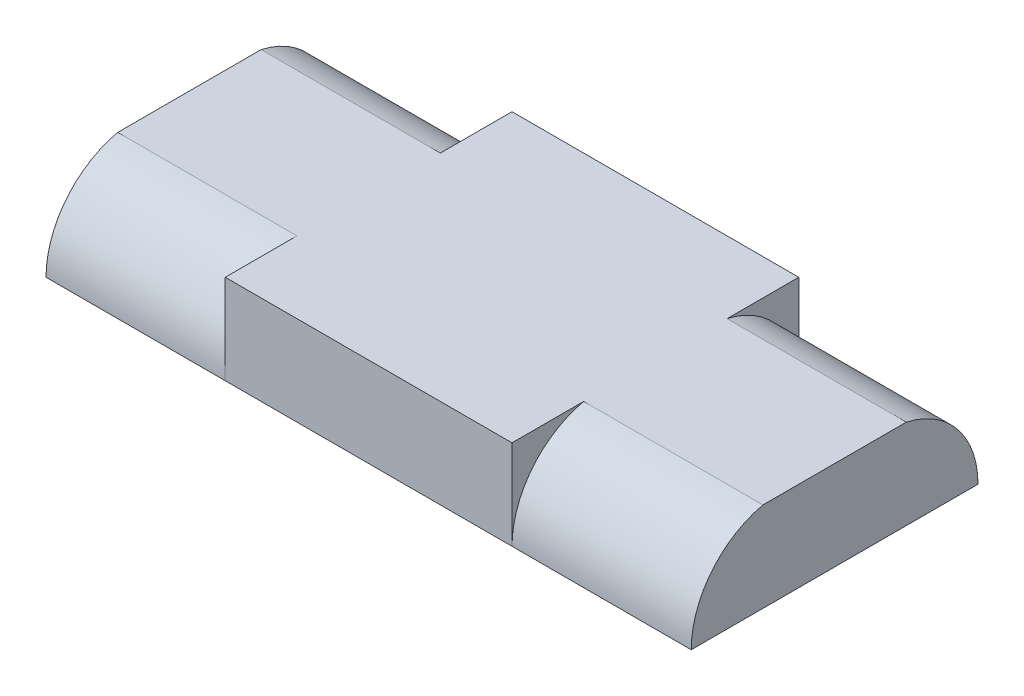
ISO-10303-21;
HEADER;
FILE_DESCRIPTION(('STEP AP214'),'2;1');
FILE_NAME('part.step','',(''),(''),'','','');
FILE_SCHEMA(('AUTOMOTIVE_DESIGN { 1 0 10303 214 1 1 1 1 }'));
ENDSEC;
DATA;
#1=APPLICATION_CONTEXT('core data for automotive mechanical design processes');
#2=APPLICATION_PROTOCOL_DEFINITION('international standard','automotive_design',2000,#1);
#3=PRODUCT_CONTEXT('',#1,'mechanical');
#4=PRODUCT('Part','Part','',(#3));
#5=PRODUCT_RELATED_PRODUCT_CATEGORY('part','',(#4));
#6=PRODUCT_DEFINITION_FORMATION('','',#4);
#7=PRODUCT_DEFINITION_CONTEXT('part definition',#1,'design');
#8=PRODUCT_DEFINITION('design','',#6,#7);
#9=PRODUCT_DEFINITION_SHAPE('','',#8);
#10=(LENGTH_UNIT() NAMED_UNIT(*) SI_UNIT(.MILLI.,.METRE.));
#11=(NAMED_UNIT(*) PLANE_ANGLE_UNIT() SI_UNIT($,.RADIAN.));
#12=(NAMED_UNIT(*) SI_UNIT($,.STERADIAN.) SOLID_ANGLE_UNIT());
#13=UNCERTAINTY_MEASURE_WITH_UNIT(LENGTH_MEASURE(1.E-05),#10,'distance_accuracy_value','');
#14=(GEOMETRIC_REPRESENTATION_CONTEXT(3) GLOBAL_UNCERTAINTY_ASSIGNED_CONTEXT((#13)) GLOBAL_UNIT_ASSIGNED_CONTEXT((#10,
#11,#12)) REPRESENTATION_CONTEXT('',''));
#15=CARTESIAN_POINT('',(0.,0.,0.));
#16=DIRECTION('',(0.,0.,1.));
#17=DIRECTION('',(1.,0.,0.));
#18=AXIS2_PLACEMENT_3D('',#15,#16,#17);
#19=CARTESIAN_POINT('',(8.,5.,-8.));
#20=DIRECTION('',(-1.,0.,0.));
#21=DIRECTION('',(0.,0.,1.));
#22=AXIS2_PLACEMENT_3D('',#19,#20,#21);
#23=PLANE('',#22);
#24=CARTESIAN_POINT('',(8.,0.,2.875));
#25=DIRECTION('',(1.,0.,0.));
#26=DIRECTION('',(0.,0.,1.));
#27=AXIS2_PLACEMENT_3D('',#24,#25,#26);
#28=CIRCLE('',#27,5.125);
#29=CARTESIAN_POINT('',(8.,5.,4.));
#30=VERTEX_POINT('',#29);
#31=CARTESIAN_POINT('',(8.,0.,8.));
#32=VERTEX_POINT('',#31);
#33=EDGE_CURVE('E225',#30,#32,#28,.T.);
#34=ORIENTED_EDGE('',*,*,#33,.F.);
#35=DIRECTION('',(0.,0.,-1.));
#36=VECTOR('',#35,1.);
#37=CARTESIAN_POINT('',(8.,5.,-8.));
#38=LINE('',#37,#36);
#39=CARTESIAN_POINT('',(8.,5.,8.));
#40=VERTEX_POINT('',#39);
#41=EDGE_CURVE('E351',#40,#30,#38,.T.);
#42=ORIENTED_EDGE('',*,*,#41,.F.);
#43=DIRECTION('',(0.,-1.,0.));
#44=VECTOR('',#43,1.);
#45=CARTESIAN_POINT('',(8.,5.,8.));
#46=LINE('',#45,#44);
#47=EDGE_CURVE('E363',#40,#32,#46,.T.);
#48=ORIENTED_EDGE('',*,*,#47,.T.);
#49=EDGE_LOOP('',(#34,#42,#48));
#50=FACE_BOUND('',#49,.T.);
#51=ADVANCED_FACE('F37',(#50),#23,.F.);
#52=CARTESIAN_POINT('',(0.,0.,0.));
#53=DIRECTION('',(0.,1.,0.));
#54=DIRECTION('',(0.,0.,1.));
#55=AXIS2_PLACEMENT_3D('',#52,#53,#54);
#56=PLANE('',#55);
#57=DIRECTION('',(1.,0.,0.));
#58=VECTOR('',#57,1.);
#59=CARTESIAN_POINT('',(-8.,0.,8.));
#60=LINE('',#59,#58);
#61=CARTESIAN_POINT('',(-8.,0.,8.));
#62=VERTEX_POINT('',#61);
#63=EDGE_CURVE('E204',#62,#32,#60,.T.);
#64=ORIENTED_EDGE('',*,*,#63,.F.);
#65=DIRECTION('',(1.,0.,0.));
#66=VECTOR('',#65,1.);
#67=CARTESIAN_POINT('',(-18.,0.,8.));
#68=LINE('',#67,#66);
#69=CARTESIAN_POINT('',(-18.,0.,8.));
#70=VERTEX_POINT('',#69);
#71=EDGE_CURVE('E200',#70,#62,#68,.T.);
#72=ORIENTED_EDGE('',*,*,#71,.F.);
#73=DIRECTION('',(0.,0.,1.));
#74=VECTOR('',#73,1.);
#75=CARTESIAN_POINT('',(-18.,0.,-4.));
#76=LINE('',#75,#74);
#77=CARTESIAN_POINT('',(-18.,0.,-8.));
#78=VERTEX_POINT('',#77);
#79=EDGE_CURVE('E186',#78,#70,#76,.T.);
#80=ORIENTED_EDGE('',*,*,#79,.F.);
#81=DIRECTION('',(1.,0.,0.));
#82=VECTOR('',#81,1.);
#83=CARTESIAN_POINT('',(-18.,0.,-8.));
#84=LINE('',#83,#82);
#85=CARTESIAN_POINT('',(-8.,0.,-8.));
#86=VERTEX_POINT('',#85);
#87=EDGE_CURVE('E218',#78,#86,#84,.T.);
#88=ORIENTED_EDGE('',*,*,#87,.T.);
#89=DIRECTION('',(-1.,0.,0.));
#90=VECTOR('',#89,1.);
#91=CARTESIAN_POINT('',(-8.,0.,-8.));
#92=LINE('',#91,#90);
#93=CARTESIAN_POINT('',(8.,0.,-8.));
#94=VERTEX_POINT('',#93);
#95=EDGE_CURVE('E323',#94,#86,#92,.T.);
#96=ORIENTED_EDGE('',*,*,#95,.F.);
#97=DIRECTION('',(-1.,0.,0.));
#98=VECTOR('',#97,1.);
#99=CARTESIAN_POINT('',(18.,0.,-8.));
#100=LINE('',#99,#98);
#101=CARTESIAN_POINT('',(18.,0.,-8.));
#102=VERTEX_POINT('',#101);
#103=EDGE_CURVE('E234',#102,#94,#100,.T.);
#104=ORIENTED_EDGE('',*,*,#103,.F.);
#105=DIRECTION('',(0.,0.,-1.));
#106=VECTOR('',#105,1.);
#107=CARTESIAN_POINT('',(18.,0.,4.));
#108=LINE('',#107,#106);
#109=CARTESIAN_POINT('',(18.,0.,8.));
#110=VERTEX_POINT('',#109);
#111=EDGE_CURVE('E297',#110,#102,#108,.T.);
#112=ORIENTED_EDGE('',*,*,#111,.F.);
#113=DIRECTION('',(-1.,0.,0.));
#114=VECTOR('',#113,1.);
#115=CARTESIAN_POINT('',(18.,0.,8.));
#116=LINE('',#115,#114);
#117=EDGE_CURVE('E222',#110,#32,#116,.T.);
#118=ORIENTED_EDGE('',*,*,#117,.T.);
#119=EDGE_LOOP('',(#64,#72,#80,#88,#96,#104,#112,#118));
#120=FACE_BOUND('',#119,.T.);
#121=DIRECTION('',(-1.,0.,0.));
#122=VECTOR('',#121,1.);
#123=CARTESIAN_POINT('',(0.,0.,3.));
#124=LINE('',#123,#122);
#125=CARTESIAN_POINT('',(17.,0.,3.));
#126=VERTEX_POINT('',#125);
#127=CARTESIAN_POINT('',(8.,0.,3.));
#128=VERTEX_POINT('',#127);
#129=EDGE_CURVE('E259',#126,#128,#124,.T.);
#130=ORIENTED_EDGE('',*,*,#129,.F.);
#131=DIRECTION('',(0.,0.,-1.));
#132=VECTOR('',#131,1.);
#133=CARTESIAN_POINT('',(17.,0.,0.));
#134=LINE('',#133,#132);
#135=CARTESIAN_POINT('',(17.,0.,-3.));
#136=VERTEX_POINT('',#135);
#137=EDGE_CURVE('E262',#126,#136,#134,.T.);
#138=ORIENTED_EDGE('',*,*,#137,.T.);
#139=DIRECTION('',(-1.,0.,0.));
#140=VECTOR('',#139,1.);
#141=CARTESIAN_POINT('',(18.,0.,-3.));
#142=LINE('',#141,#140);
#143=CARTESIAN_POINT('',(8.,0.,-3.));
#144=VERTEX_POINT('',#143);
#145=EDGE_CURVE('E246',#136,#144,#142,.T.);
#146=ORIENTED_EDGE('',*,*,#145,.T.);
#147=DIRECTION('',(0.,0.,-1.));
#148=VECTOR('',#147,1.);
#149=CARTESIAN_POINT('',(8.,0.,-8.));
#150=LINE('',#149,#148);
#151=EDGE_CURVE('E271',#128,#144,#150,.T.);
#152=ORIENTED_EDGE('',*,*,#151,.F.);
#153=EDGE_LOOP('',(#130,#138,#146,#152));
#154=FACE_BOUND('',#153,.T.);
#155=DIRECTION('',(1.,0.,0.));
#156=VECTOR('',#155,1.);
#157=CARTESIAN_POINT('',(-8.,0.,7.));
#158=LINE('',#157,#156);
#159=CARTESIAN_POINT('',(-7.,0.,7.));
#160=VERTEX_POINT('',#159);
#161=CARTESIAN_POINT('',(7.,0.,7.));
#162=VERTEX_POINT('',#161);
#163=EDGE_CURVE('E329',#160,#162,#158,.T.);
#164=ORIENTED_EDGE('',*,*,#163,.T.);
#165=DIRECTION('',(0.,0.,-1.));
#166=VECTOR('',#165,1.);
#167=CARTESIAN_POINT('',(7.,0.,-8.));
#168=LINE('',#167,#166);
#169=CARTESIAN_POINT('',(7.,0.,-7.));
#170=VERTEX_POINT('',#169);
#171=EDGE_CURVE('E319',#162,#170,#168,.T.);
#172=ORIENTED_EDGE('',*,*,#171,.T.);
#173=DIRECTION('',(-1.,0.,0.));
#174=VECTOR('',#173,1.);
#175=CARTESIAN_POINT('',(-8.,0.,-7.));
#176=LINE('',#175,#174);
#177=CARTESIAN_POINT('',(-7.,0.,-7.));
#178=VERTEX_POINT('',#177);
#179=EDGE_CURVE('E343',#170,#178,#176,.T.);
#180=ORIENTED_EDGE('',*,*,#179,.T.);
#181=DIRECTION('',(0.,0.,1.));
#182=VECTOR('',#181,1.);
#183=CARTESIAN_POINT('',(-7.,0.,-8.));
#184=LINE('',#183,#182);
#185=EDGE_CURVE('E346',#178,#160,#184,.T.);
#186=ORIENTED_EDGE('',*,*,#185,.T.);
#187=EDGE_LOOP('',(#164,#172,#180,#186));
#188=FACE_BOUND('',#187,.T.);
#189=DIRECTION('',(0.,0.,1.));
#190=VECTOR('',#189,1.);
#191=CARTESIAN_POINT('',(-8.,0.,-8.));
#192=LINE('',#191,#190);
#193=CARTESIAN_POINT('',(-8.,0.,-3.));
#194=VERTEX_POINT('',#193);
#195=CARTESIAN_POINT('',(-8.,0.,3.));
#196=VERTEX_POINT('',#195);
#197=EDGE_CURVE('E280',#194,#196,#192,.T.);
#198=ORIENTED_EDGE('',*,*,#197,.F.);
#199=DIRECTION('',(1.,0.,0.));
#200=VECTOR('',#199,1.);
#201=CARTESIAN_POINT('',(0.,0.,-3.));
#202=LINE('',#201,#200);
#203=CARTESIAN_POINT('',(-17.,0.,-3.));
#204=VERTEX_POINT('',#203);
#205=EDGE_CURVE('E267',#204,#194,#202,.T.);
#206=ORIENTED_EDGE('',*,*,#205,.F.);
#207=DIRECTION('',(0.,0.,1.));
#208=VECTOR('',#207,1.);
#209=CARTESIAN_POINT('',(-17.,0.,0.));
#210=LINE('',#209,#208);
#211=CARTESIAN_POINT('',(-17.,0.,3.));
#212=VERTEX_POINT('',#211);
#213=EDGE_CURVE('E258',#204,#212,#210,.T.);
#214=ORIENTED_EDGE('',*,*,#213,.T.);
#215=DIRECTION('',(1.,0.,0.));
#216=VECTOR('',#215,1.);
#217=CARTESIAN_POINT('',(-18.,0.,3.));
#218=LINE('',#217,#216);
#219=EDGE_CURVE('E256',#212,#196,#218,.T.);
#220=ORIENTED_EDGE('',*,*,#219,.T.);
#221=EDGE_LOOP('',(#198,#206,#214,#220));
#222=FACE_BOUND('',#221,.T.);
#223=ADVANCED_FACE('F201',(#120,#154,#188,#222),#56,.F.);
#224=CARTESIAN_POINT('',(8.,0.,-2.875));
#225=DIRECTION('',(1.,0.,0.));
#226=DIRECTION('',(0.,0.,-1.));
#227=AXIS2_PLACEMENT_3D('',#224,#225,#226);
#228=CIRCLE('',#227,5.125);
#229=CARTESIAN_POINT('',(8.,5.,-4.));
#230=VERTEX_POINT('',#229);
#231=EDGE_CURVE('E228',#94,#230,#228,.T.);
#232=ORIENTED_EDGE('',*,*,#231,.F.);
#233=DIRECTION('',(0.,-1.,0.));
#234=VECTOR('',#233,1.);
#235=CARTESIAN_POINT('',(8.,5.,-8.));
#236=LINE('',#235,#234);
#237=CARTESIAN_POINT('',(8.,5.,-8.));
#238=VERTEX_POINT('',#237);
#239=EDGE_CURVE('E44',#238,#94,#236,.T.);
#240=ORIENTED_EDGE('',*,*,#239,.F.);
#241=EDGE_CURVE('E355',#230,#238,#38,.T.);
#242=ORIENTED_EDGE('',*,*,#241,.F.);
#243=EDGE_LOOP('',(#232,#240,#242));
#244=FACE_BOUND('',#243,.T.);
#245=ADVANCED_FACE('F384',(#244),#23,.F.);
#246=CARTESIAN_POINT('',(-8.,5.,-8.));
#247=DIRECTION('',(1.,0.,0.));
#248=DIRECTION('',(0.,0.,-1.));
#249=AXIS2_PLACEMENT_3D('',#246,#247,#248);
#250=PLANE('',#249);
#251=DIRECTION('',(0.,-1.,0.));
#252=VECTOR('',#251,1.);
#253=CARTESIAN_POINT('',(-8.,5.,-8.));
#254=LINE('',#253,#252);
#255=CARTESIAN_POINT('',(-8.,5.,-8.));
#256=VERTEX_POINT('',#255);
#257=EDGE_CURVE('E372',#256,#86,#254,.T.);
#258=ORIENTED_EDGE('',*,*,#257,.T.);
#259=CARTESIAN_POINT('',(-8.,0.,-2.875));
#260=DIRECTION('',(1.,0.,0.));
#261=DIRECTION('',(0.,0.,-1.));
#262=AXIS2_PLACEMENT_3D('',#259,#260,#261);
#263=CIRCLE('',#262,5.125);
#264=CARTESIAN_POINT('',(-8.,5.,-4.));
#265=VERTEX_POINT('',#264);
#266=EDGE_CURVE('E207',#86,#265,#263,.T.);
#267=ORIENTED_EDGE('',*,*,#266,.T.);
#268=DIRECTION('',(0.,0.,1.));
#269=VECTOR('',#268,1.);
#270=CARTESIAN_POINT('',(-8.,5.,-8.));
#271=LINE('',#270,#269);
#272=EDGE_CURVE('E358',#256,#265,#271,.T.);
#273=ORIENTED_EDGE('',*,*,#272,.F.);
#274=EDGE_LOOP('',(#258,#267,#273));
#275=FACE_BOUND('',#274,.T.);
#276=ADVANCED_FACE('F394',(#275),#250,.F.);
#277=CARTESIAN_POINT('',(-8.,5.,4.));
#278=VERTEX_POINT('',#277);
#279=CARTESIAN_POINT('',(-8.,5.,8.));
#280=VERTEX_POINT('',#279);
#281=EDGE_CURVE('E357',#278,#280,#271,.T.);
#282=ORIENTED_EDGE('',*,*,#281,.F.);
#283=CARTESIAN_POINT('',(-8.,0.,2.875));
#284=DIRECTION('',(1.,0.,0.));
#285=DIRECTION('',(0.,0.,1.));
#286=AXIS2_PLACEMENT_3D('',#283,#284,#285);
#287=CIRCLE('',#286,5.125);
#288=EDGE_CURVE('E213',#278,#62,#287,.T.);
#289=ORIENTED_EDGE('',*,*,#288,.T.);
#290=DIRECTION('',(0.,-1.,0.));
#291=VECTOR('',#290,1.);
#292=CARTESIAN_POINT('',(-8.,5.,8.));
#293=LINE('',#292,#291);
#294=EDGE_CURVE('E369',#280,#62,#293,.T.);
#295=ORIENTED_EDGE('',*,*,#294,.F.);
#296=EDGE_LOOP('',(#282,#289,#295));
#297=FACE_BOUND('',#296,.T.);
#298=ADVANCED_FACE('F415',(#297),#250,.F.);
#299=CARTESIAN_POINT('',(-8.,5.,-8.));
#300=DIRECTION('',(0.,0.,1.));
#301=DIRECTION('',(1.,0.,0.));
#302=AXIS2_PLACEMENT_3D('',#299,#300,#301);
#303=PLANE('',#302);
#304=ORIENTED_EDGE('',*,*,#95,.T.);
#305=ORIENTED_EDGE('',*,*,#257,.F.);
#306=DIRECTION('',(-1.,0.,0.));
#307=VECTOR('',#306,1.);
#308=CARTESIAN_POINT('',(-8.,5.,-8.));
#309=LINE('',#308,#307);
#310=EDGE_CURVE('E354',#238,#256,#309,.T.);
#311=ORIENTED_EDGE('',*,*,#310,.F.);
#312=ORIENTED_EDGE('',*,*,#239,.T.);
#313=EDGE_LOOP('',(#304,#305,#311,#312));
#314=FACE_BOUND('',#313,.T.);
#315=ADVANCED_FACE('F378',(#314),#303,.F.);
#316=CARTESIAN_POINT('',(-8.,5.,8.));
#317=DIRECTION('',(0.,0.,-1.));
#318=DIRECTION('',(-1.,0.,0.));
#319=AXIS2_PLACEMENT_3D('',#316,#317,#318);
#320=PLANE('',#319);
#321=ORIENTED_EDGE('',*,*,#63,.T.);
#322=ORIENTED_EDGE('',*,*,#47,.F.);
#323=DIRECTION('',(1.,0.,0.));
#324=VECTOR('',#323,1.);
#325=CARTESIAN_POINT('',(-8.,5.,8.));
#326=LINE('',#325,#324);
#327=EDGE_CURVE('E361',#280,#40,#326,.T.);
#328=ORIENTED_EDGE('',*,*,#327,.F.);
#329=ORIENTED_EDGE('',*,*,#294,.T.);
#330=EDGE_LOOP('',(#321,#322,#328,#329));
#331=FACE_BOUND('',#330,.T.);
#332=ADVANCED_FACE('F410',(#331),#320,.F.);
#333=CARTESIAN_POINT('',(0.,5.,0.));
#334=DIRECTION('',(0.,1.,0.));
#335=DIRECTION('',(0.,0.,1.));
#336=AXIS2_PLACEMENT_3D('',#333,#334,#335);
#337=PLANE('',#336);
#338=ORIENTED_EDGE('',*,*,#41,.T.);
#339=DIRECTION('',(-1.,0.,0.));
#340=VECTOR('',#339,1.);
#341=CARTESIAN_POINT('',(18.,5.,4.));
#342=LINE('',#341,#340);
#343=CARTESIAN_POINT('',(18.,5.,4.));
#344=VERTEX_POINT('',#343);
#345=EDGE_CURVE('E302',#344,#30,#342,.T.);
#346=ORIENTED_EDGE('',*,*,#345,.F.);
#347=DIRECTION('',(0.,0.,1.));
#348=VECTOR('',#347,1.);
#349=CARTESIAN_POINT('',(18.,5.,4.));
#350=LINE('',#349,#348);
#351=CARTESIAN_POINT('',(18.,5.,-4.));
#352=VERTEX_POINT('',#351);
#353=EDGE_CURVE('E299',#352,#344,#350,.T.);
#354=ORIENTED_EDGE('',*,*,#353,.F.);
#355=DIRECTION('',(-1.,0.,0.));
#356=VECTOR('',#355,1.);
#357=CARTESIAN_POINT('',(18.,5.,-4.));
#358=LINE('',#357,#356);
#359=EDGE_CURVE('E197',#352,#230,#358,.T.);
#360=ORIENTED_EDGE('',*,*,#359,.T.);
#361=ORIENTED_EDGE('',*,*,#241,.T.);
#362=ORIENTED_EDGE('',*,*,#310,.T.);
#363=ORIENTED_EDGE('',*,*,#272,.T.);
#364=DIRECTION('',(1.,0.,0.));
#365=VECTOR('',#364,1.);
#366=CARTESIAN_POINT('',(-18.,5.,-4.));
#367=LINE('',#366,#365);
#368=CARTESIAN_POINT('',(-18.,5.,-4.));
#369=VERTEX_POINT('',#368);
#370=EDGE_CURVE('E307',#369,#265,#367,.T.);
#371=ORIENTED_EDGE('',*,*,#370,.F.);
#372=DIRECTION('',(0.,0.,-1.));
#373=VECTOR('',#372,1.);
#374=CARTESIAN_POINT('',(-18.,5.,-4.));
#375=LINE('',#374,#373);
#376=CARTESIAN_POINT('',(-18.,5.,4.));
#377=VERTEX_POINT('',#376);
#378=EDGE_CURVE('E196',#377,#369,#375,.T.);
#379=ORIENTED_EDGE('',*,*,#378,.F.);
#380=DIRECTION('',(1.,0.,0.));
#381=VECTOR('',#380,1.);
#382=CARTESIAN_POINT('',(-18.,5.,4.));
#383=LINE('',#382,#381);
#384=EDGE_CURVE('E211',#377,#278,#383,.T.);
#385=ORIENTED_EDGE('',*,*,#384,.T.);
#386=ORIENTED_EDGE('',*,*,#281,.T.);
#387=ORIENTED_EDGE('',*,*,#327,.T.);
#388=EDGE_LOOP('',(#338,#346,#354,#360,#361,#362,#363,#371,#379,#385,#386,#387));
#389=FACE_BOUND('',#388,.T.);
#390=ADVANCED_FACE('F396',(#389),#337,.T.);
#391=CARTESIAN_POINT('',(7.,5.,-8.));
#392=DIRECTION('',(-1.,0.,0.));
#393=DIRECTION('',(0.,0.,1.));
#394=AXIS2_PLACEMENT_3D('',#391,#392,#393);
#395=PLANE('',#394);
#396=ORIENTED_EDGE('',*,*,#171,.F.);
#397=DIRECTION('',(0.,-1.,0.));
#398=VECTOR('',#397,1.);
#399=CARTESIAN_POINT('',(7.,5.,7.));
#400=LINE('',#399,#398);
#401=CARTESIAN_POINT('',(7.,4.,7.));
#402=VERTEX_POINT('',#401);
#403=EDGE_CURVE('E330',#402,#162,#400,.T.);
#404=ORIENTED_EDGE('',*,*,#403,.F.);
#405=DIRECTION('',(0.,0.,-1.));
#406=VECTOR('',#405,1.);
#407=CARTESIAN_POINT('',(7.,4.,-8.));
#408=LINE('',#407,#406);
#409=CARTESIAN_POINT('',(7.,4.,-7.));
#410=VERTEX_POINT('',#409);
#411=EDGE_CURVE('E325',#402,#410,#408,.T.);
#412=ORIENTED_EDGE('',*,*,#411,.T.);
#413=DIRECTION('',(0.,-1.,0.));
#414=VECTOR('',#413,1.);
#415=CARTESIAN_POINT('',(7.,5.,-7.));
#416=LINE('',#415,#414);
#417=EDGE_CURVE('E320',#410,#170,#416,.T.);
#418=ORIENTED_EDGE('',*,*,#417,.T.);
#419=EDGE_LOOP('',(#396,#404,#412,#418));
#420=FACE_BOUND('',#419,.T.);
#421=ADVANCED_FACE('F472',(#420),#395,.T.);
#422=CARTESIAN_POINT('',(-8.,5.,-7.));
#423=DIRECTION('',(0.,0.,1.));
#424=DIRECTION('',(1.,0.,0.));
#425=AXIS2_PLACEMENT_3D('',#422,#423,#424);
#426=PLANE('',#425);
#427=ORIENTED_EDGE('',*,*,#179,.F.);
#428=ORIENTED_EDGE('',*,*,#417,.F.);
#429=DIRECTION('',(-1.,0.,0.));
#430=VECTOR('',#429,1.);
#431=CARTESIAN_POINT('',(-8.,4.,-7.));
#432=LINE('',#431,#430);
#433=CARTESIAN_POINT('',(-7.,4.,-7.));
#434=VERTEX_POINT('',#433);
#435=EDGE_CURVE('E328',#410,#434,#432,.T.);
#436=ORIENTED_EDGE('',*,*,#435,.T.);
#437=DIRECTION('',(0.,-1.,0.));
#438=VECTOR('',#437,1.);
#439=CARTESIAN_POINT('',(-7.,5.,-7.));
#440=LINE('',#439,#438);
#441=EDGE_CURVE('E324',#434,#178,#440,.T.);
#442=ORIENTED_EDGE('',*,*,#441,.T.);
#443=EDGE_LOOP('',(#427,#428,#436,#442));
#444=FACE_BOUND('',#443,.T.);
#445=ADVANCED_FACE('F732',(#444),#426,.T.);
#446=CARTESIAN_POINT('',(-7.,5.,-8.));
#447=DIRECTION('',(1.,0.,0.));
#448=DIRECTION('',(0.,0.,-1.));
#449=AXIS2_PLACEMENT_3D('',#446,#447,#448);
#450=PLANE('',#449);
#451=ORIENTED_EDGE('',*,*,#185,.F.);
#452=ORIENTED_EDGE('',*,*,#441,.F.);
#453=DIRECTION('',(0.,0.,1.));
#454=VECTOR('',#453,1.);
#455=CARTESIAN_POINT('',(-7.,4.,-8.));
#456=LINE('',#455,#454);
#457=CARTESIAN_POINT('',(-7.,4.,7.));
#458=VERTEX_POINT('',#457);
#459=EDGE_CURVE('E337',#434,#458,#456,.T.);
#460=ORIENTED_EDGE('',*,*,#459,.T.);
#461=DIRECTION('',(0.,-1.,0.));
#462=VECTOR('',#461,1.);
#463=CARTESIAN_POINT('',(-7.,5.,7.));
#464=LINE('',#463,#462);
#465=EDGE_CURVE('E332',#458,#160,#464,.T.);
#466=ORIENTED_EDGE('',*,*,#465,.T.);
#467=EDGE_LOOP('',(#451,#452,#460,#466));
#468=FACE_BOUND('',#467,.T.);
#469=ADVANCED_FACE('F721',(#468),#450,.T.);
#470=CARTESIAN_POINT('',(-8.,5.,7.));
#471=DIRECTION('',(0.,0.,-1.));
#472=DIRECTION('',(-1.,0.,0.));
#473=AXIS2_PLACEMENT_3D('',#470,#471,#472);
#474=PLANE('',#473);
#475=ORIENTED_EDGE('',*,*,#163,.F.);
#476=ORIENTED_EDGE('',*,*,#465,.F.);
#477=DIRECTION('',(1.,0.,0.));
#478=VECTOR('',#477,1.);
#479=CARTESIAN_POINT('',(-8.,4.,7.));
#480=LINE('',#479,#478);
#481=EDGE_CURVE('E333',#458,#402,#480,.T.);
#482=ORIENTED_EDGE('',*,*,#481,.T.);
#483=ORIENTED_EDGE('',*,*,#403,.T.);
#484=EDGE_LOOP('',(#475,#476,#482,#483));
#485=FACE_BOUND('',#484,.T.);
#486=ADVANCED_FACE('F711',(#485),#474,.T.);
#487=CARTESIAN_POINT('',(0.,4.,0.));
#488=DIRECTION('',(0.,1.,0.));
#489=DIRECTION('',(0.,0.,1.));
#490=AXIS2_PLACEMENT_3D('',#487,#488,#489);
#491=PLANE('',#490);
#492=CARTESIAN_POINT('',(0.,4.,0.));
#493=DIRECTION('',(0.,1.,0.));
#494=DIRECTION('',(0.,0.,1.));
#495=AXIS2_PLACEMENT_3D('',#492,#493,#494);
#496=CIRCLE('',#495,2.7);
#497=CARTESIAN_POINT('',(0.,4.,2.7));
#498=VERTEX_POINT('',#497);
#499=EDGE_CURVE('E11',#498,#498,#496,.F.);
#500=ORIENTED_EDGE('',*,*,#499,.F.);
#501=EDGE_LOOP('',(#500));
#502=FACE_BOUND('',#501,.T.);
#503=ORIENTED_EDGE('',*,*,#411,.F.);
#504=ORIENTED_EDGE('',*,*,#481,.F.);
#505=ORIENTED_EDGE('',*,*,#459,.F.);
#506=ORIENTED_EDGE('',*,*,#435,.F.);
#507=EDGE_LOOP('',(#503,#504,#505,#506));
#508=FACE_BOUND('',#507,.T.);
#509=ADVANCED_FACE('F693',(#502,#508),#491,.F.);
#510=CARTESIAN_POINT('',(0.,-7.63675323681471,0.));
#511=DIRECTION('',(0.,1.,0.));
#512=DIRECTION('',(0.,0.,1.));
#513=AXIS2_PLACEMENT_3D('',#510,#511,#512);
#514=CYLINDRICAL_SURFACE('',#513,2.7);
#515=CARTESIAN_POINT('',(0.,0.,0.));
#516=DIRECTION('',(0.,1.,0.));
#517=DIRECTION('',(0.,0.,1.));
#518=AXIS2_PLACEMENT_3D('',#515,#516,#517);
#519=CIRCLE('',#518,2.7);
#520=CARTESIAN_POINT('',(0.,0.,2.7));
#521=VERTEX_POINT('',#520);
#522=EDGE_CURVE('E313',#521,#521,#519,.T.);
#523=ORIENTED_EDGE('',*,*,#522,.T.);
#524=EDGE_LOOP('',(#523));
#525=FACE_BOUND('',#524,.T.);
#526=ORIENTED_EDGE('',*,*,#499,.T.);
#527=EDGE_LOOP('',(#526));
#528=FACE_BOUND('',#527,.T.);
#529=ADVANCED_FACE('F682',(#525,#528),#514,.T.);
#530=CARTESIAN_POINT('',(0.,-7.63675323681471,0.));
#531=DIRECTION('',(0.,1.,0.));
#532=DIRECTION('',(0.,0.,1.));
#533=AXIS2_PLACEMENT_3D('',#530,#531,#532);
#534=CYLINDRICAL_SURFACE('',#533,1.7);
#535=CARTESIAN_POINT('',(0.,0.,0.));
#536=DIRECTION('',(0.,1.,0.));
#537=DIRECTION('',(0.,0.,1.));
#538=AXIS2_PLACEMENT_3D('',#535,#536,#537);
#539=CIRCLE('',#538,1.7);
#540=CARTESIAN_POINT('',(0.,0.,1.7));
#541=VERTEX_POINT('',#540);
#542=EDGE_CURVE('E316',#541,#541,#539,.T.);
#543=ORIENTED_EDGE('',*,*,#542,.F.);
#544=EDGE_LOOP('',(#543));
#545=FACE_BOUND('',#544,.T.);
#546=CARTESIAN_POINT('',(0.,4.,0.));
#547=DIRECTION('',(0.,-1.,0.));
#548=DIRECTION('',(0.,0.,-1.));
#549=AXIS2_PLACEMENT_3D('',#546,#547,#548);
#550=CIRCLE('',#549,1.7);
#551=CARTESIAN_POINT('',(0.,4.,-1.7));
#552=VERTEX_POINT('',#551);
#553=EDGE_CURVE('E310',#552,#552,#550,.T.);
#554=ORIENTED_EDGE('',*,*,#553,.F.);
#555=EDGE_LOOP('',(#554));
#556=FACE_BOUND('',#555,.T.);
#557=ADVANCED_FACE('F670',(#545,#556),#534,.F.);
#558=CARTESIAN_POINT('',(0.,0.,0.));
#559=DIRECTION('',(0.,1.,0.));
#560=DIRECTION('',(0.,0.,1.));
#561=AXIS2_PLACEMENT_3D('',#558,#559,#560);
#562=PLANE('',#561);
#563=ORIENTED_EDGE('',*,*,#542,.T.);
#564=EDGE_LOOP('',(#563));
#565=FACE_BOUND('',#564,.T.);
#566=ORIENTED_EDGE('',*,*,#522,.F.);
#567=EDGE_LOOP('',(#566));
#568=FACE_BOUND('',#567,.T.);
#569=ADVANCED_FACE('F664',(#565,#568),#562,.F.);
#570=ORIENTED_EDGE('',*,*,#553,.T.);
#571=EDGE_LOOP('',(#570));
#572=FACE_BOUND('',#571,.T.);
#573=ADVANCED_FACE('F485',(#572),#491,.F.);
#574=CARTESIAN_POINT('',(-18.,0.,0.));
#575=DIRECTION('',(-1.,0.,0.));
#576=DIRECTION('',(0.,0.,1.));
#577=AXIS2_PLACEMENT_3D('',#574,#575,#576);
#578=PLANE('',#577);
#579=ORIENTED_EDGE('',*,*,#378,.T.);
#580=CARTESIAN_POINT('',(-18.,0.,-2.875));
#581=DIRECTION('',(1.,0.,0.));
#582=DIRECTION('',(0.,0.,-1.));
#583=AXIS2_PLACEMENT_3D('',#580,#581,#582);
#584=CIRCLE('',#583,5.125);
#585=EDGE_CURVE('E193',#78,#369,#584,.T.);
#586=ORIENTED_EDGE('',*,*,#585,.F.);
#587=ORIENTED_EDGE('',*,*,#79,.T.);
#588=CARTESIAN_POINT('',(-18.,0.,2.875));
#589=DIRECTION('',(1.,0.,0.));
#590=DIRECTION('',(0.,0.,1.));
#591=AXIS2_PLACEMENT_3D('',#588,#589,#590);
#592=CIRCLE('',#591,5.125);
#593=EDGE_CURVE('E191',#377,#70,#592,.T.);
#594=ORIENTED_EDGE('',*,*,#593,.F.);
#595=EDGE_LOOP('',(#579,#586,#587,#594));
#596=FACE_BOUND('',#595,.T.);
#597=ADVANCED_FACE('F189',(#596),#578,.T.);
#598=CARTESIAN_POINT('',(18.,0.,0.));
#599=DIRECTION('',(-1.,0.,0.));
#600=DIRECTION('',(0.,0.,1.));
#601=AXIS2_PLACEMENT_3D('',#598,#599,#600);
#602=PLANE('',#601);
#603=ORIENTED_EDGE('',*,*,#353,.T.);
#604=CARTESIAN_POINT('',(18.,0.,2.875));
#605=DIRECTION('',(1.,0.,0.));
#606=DIRECTION('',(0.,0.,1.));
#607=AXIS2_PLACEMENT_3D('',#604,#605,#606);
#608=CIRCLE('',#607,5.125);
#609=EDGE_CURVE('E224',#344,#110,#608,.T.);
#610=ORIENTED_EDGE('',*,*,#609,.T.);
#611=ORIENTED_EDGE('',*,*,#111,.T.);
#612=CARTESIAN_POINT('',(18.,0.,-2.875));
#613=DIRECTION('',(1.,0.,0.));
#614=DIRECTION('',(0.,0.,-1.));
#615=AXIS2_PLACEMENT_3D('',#612,#613,#614);
#616=CIRCLE('',#615,5.125);
#617=EDGE_CURVE('E231',#102,#352,#616,.T.);
#618=ORIENTED_EDGE('',*,*,#617,.T.);
#619=EDGE_LOOP('',(#603,#610,#611,#618));
#620=FACE_BOUND('',#619,.T.);
#621=ADVANCED_FACE('F401',(#620),#602,.F.);
#622=CARTESIAN_POINT('',(0.,4.,0.));
#623=DIRECTION('',(0.,1.,0.));
#624=DIRECTION('',(0.,0.,1.));
#625=AXIS2_PLACEMENT_3D('',#622,#623,#624);
#626=PLANE('',#625);
#627=DIRECTION('',(0.,0.,-1.));
#628=VECTOR('',#627,1.);
#629=CARTESIAN_POINT('',(8.,4.,-8.));
#630=LINE('',#629,#628);
#631=CARTESIAN_POINT('',(8.,4.,3.));
#632=VERTEX_POINT('',#631);
#633=CARTESIAN_POINT('',(8.,4.,-3.));
#634=VERTEX_POINT('',#633);
#635=EDGE_CURVE('E291',#632,#634,#630,.T.);
#636=ORIENTED_EDGE('',*,*,#635,.T.);
#637=DIRECTION('',(-1.,0.,0.));
#638=VECTOR('',#637,1.);
#639=CARTESIAN_POINT('',(18.,4.,-3.));
#640=LINE('',#639,#638);
#641=CARTESIAN_POINT('',(17.,4.,-3.));
#642=VERTEX_POINT('',#641);
#643=EDGE_CURVE('E241',#642,#634,#640,.T.);
#644=ORIENTED_EDGE('',*,*,#643,.F.);
#645=DIRECTION('',(0.,0.,1.));
#646=VECTOR('',#645,1.);
#647=CARTESIAN_POINT('',(17.,4.,0.));
#648=LINE('',#647,#646);
#649=CARTESIAN_POINT('',(17.,4.,3.));
#650=VERTEX_POINT('',#649);
#651=EDGE_CURVE('E242',#642,#650,#648,.T.);
#652=ORIENTED_EDGE('',*,*,#651,.T.);
#653=DIRECTION('',(-1.,0.,0.));
#654=VECTOR('',#653,1.);
#655=CARTESIAN_POINT('',(0.,4.,3.));
#656=LINE('',#655,#654);
#657=EDGE_CURVE('E238',#650,#632,#656,.T.);
#658=ORIENTED_EDGE('',*,*,#657,.T.);
#659=EDGE_LOOP('',(#636,#644,#652,#658));
#660=FACE_BOUND('',#659,.T.);
#661=ADVANCED_FACE('F545',(#660),#626,.F.);
#662=CARTESIAN_POINT('',(8.,5.,-8.));
#663=DIRECTION('',(-1.,0.,0.));
#664=DIRECTION('',(0.,0.,1.));
#665=AXIS2_PLACEMENT_3D('',#662,#663,#664);
#666=PLANE('',#665);
#667=DIRECTION('',(0.,-1.,0.));
#668=VECTOR('',#667,1.);
#669=CARTESIAN_POINT('',(8.,5.,3.));
#670=LINE('',#669,#668);
#671=EDGE_CURVE('E285',#632,#128,#670,.T.);
#672=ORIENTED_EDGE('',*,*,#671,.T.);
#673=ORIENTED_EDGE('',*,*,#151,.T.);
#674=DIRECTION('',(0.,-1.,0.));
#675=VECTOR('',#674,1.);
#676=CARTESIAN_POINT('',(8.,0.,-3.));
#677=LINE('',#676,#675);
#678=EDGE_CURVE('E283',#634,#144,#677,.T.);
#679=ORIENTED_EDGE('',*,*,#678,.F.);
#680=ORIENTED_EDGE('',*,*,#635,.F.);
#681=EDGE_LOOP('',(#672,#673,#679,#680));
#682=FACE_BOUND('',#681,.T.);
#683=ADVANCED_FACE('F612',(#682),#666,.F.);
#684=CARTESIAN_POINT('',(18.,0.,3.));
#685=DIRECTION('',(0.,0.,-1.));
#686=DIRECTION('',(-1.,0.,0.));
#687=AXIS2_PLACEMENT_3D('',#684,#685,#686);
#688=PLANE('',#687);
#689=ORIENTED_EDGE('',*,*,#657,.F.);
#690=DIRECTION('',(0.,-1.,0.));
#691=VECTOR('',#690,1.);
#692=CARTESIAN_POINT('',(17.,0.,3.));
#693=LINE('',#692,#691);
#694=EDGE_CURVE('E237',#650,#126,#693,.T.);
#695=ORIENTED_EDGE('',*,*,#694,.T.);
#696=ORIENTED_EDGE('',*,*,#129,.T.);
#697=ORIENTED_EDGE('',*,*,#671,.F.);
#698=EDGE_LOOP('',(#689,#695,#696,#697));
#699=FACE_BOUND('',#698,.T.);
#700=ADVANCED_FACE('F603',(#699),#688,.T.);
#701=CARTESIAN_POINT('',(18.,0.,-3.));
#702=DIRECTION('',(0.,0.,1.));
#703=DIRECTION('',(1.,0.,0.));
#704=AXIS2_PLACEMENT_3D('',#701,#702,#703);
#705=PLANE('',#704);
#706=ORIENTED_EDGE('',*,*,#678,.T.);
#707=ORIENTED_EDGE('',*,*,#145,.F.);
#708=DIRECTION('',(0.,1.,0.));
#709=VECTOR('',#708,1.);
#710=CARTESIAN_POINT('',(17.,0.,-3.));
#711=LINE('',#710,#709);
#712=EDGE_CURVE('E59',#136,#642,#711,.T.);
#713=ORIENTED_EDGE('',*,*,#712,.T.);
#714=ORIENTED_EDGE('',*,*,#643,.T.);
#715=EDGE_LOOP('',(#706,#707,#713,#714));
#716=FACE_BOUND('',#715,.T.);
#717=ADVANCED_FACE('F594',(#716),#705,.T.);
#718=CARTESIAN_POINT('',(17.,0.,0.));
#719=DIRECTION('',(-1.,0.,0.));
#720=DIRECTION('',(0.,0.,1.));
#721=AXIS2_PLACEMENT_3D('',#718,#719,#720);
#722=PLANE('',#721);
#723=ORIENTED_EDGE('',*,*,#694,.F.);
#724=ORIENTED_EDGE('',*,*,#651,.F.);
#725=ORIENTED_EDGE('',*,*,#712,.F.);
#726=ORIENTED_EDGE('',*,*,#137,.F.);
#727=EDGE_LOOP('',(#723,#724,#725,#726));
#728=FACE_BOUND('',#727,.T.);
#729=ADVANCED_FACE('F584',(#728),#722,.T.);
#730=CARTESIAN_POINT('',(-17.,0.,0.));
#731=DIRECTION('',(-1.,0.,0.));
#732=DIRECTION('',(0.,0.,1.));
#733=AXIS2_PLACEMENT_3D('',#730,#731,#732);
#734=PLANE('',#733);
#735=DIRECTION('',(0.,-1.,0.));
#736=VECTOR('',#735,1.);
#737=CARTESIAN_POINT('',(-17.,5.,-3.));
#738=LINE('',#737,#736);
#739=CARTESIAN_POINT('',(-17.,4.,-3.));
#740=VERTEX_POINT('',#739);
#741=EDGE_CURVE('E51',#740,#204,#738,.T.);
#742=ORIENTED_EDGE('',*,*,#741,.F.);
#743=DIRECTION('',(0.,0.,-1.));
#744=VECTOR('',#743,1.);
#745=CARTESIAN_POINT('',(-17.,4.,0.));
#746=LINE('',#745,#744);
#747=CARTESIAN_POINT('',(-17.,4.,3.));
#748=VERTEX_POINT('',#747);
#749=EDGE_CURVE('E251',#748,#740,#746,.T.);
#750=ORIENTED_EDGE('',*,*,#749,.F.);
#751=DIRECTION('',(0.,1.,0.));
#752=VECTOR('',#751,1.);
#753=CARTESIAN_POINT('',(-17.,5.,3.));
#754=LINE('',#753,#752);
#755=EDGE_CURVE('E253',#212,#748,#754,.T.);
#756=ORIENTED_EDGE('',*,*,#755,.F.);
#757=ORIENTED_EDGE('',*,*,#213,.F.);
#758=EDGE_LOOP('',(#742,#750,#756,#757));
#759=FACE_BOUND('',#758,.T.);
#760=ADVANCED_FACE('F574',(#759),#734,.F.);
#761=CARTESIAN_POINT('',(-18.,5.,3.));
#762=DIRECTION('',(0.,0.,-1.));
#763=DIRECTION('',(-1.,0.,0.));
#764=AXIS2_PLACEMENT_3D('',#761,#762,#763);
#765=PLANE('',#764);
#766=DIRECTION('',(0.,-1.,0.));
#767=VECTOR('',#766,1.);
#768=CARTESIAN_POINT('',(-8.,5.,3.));
#769=LINE('',#768,#767);
#770=CARTESIAN_POINT('',(-8.,4.,3.));
#771=VERTEX_POINT('',#770);
#772=EDGE_CURVE('E287',#771,#196,#769,.T.);
#773=ORIENTED_EDGE('',*,*,#772,.T.);
#774=ORIENTED_EDGE('',*,*,#219,.F.);
#775=ORIENTED_EDGE('',*,*,#755,.T.);
#776=DIRECTION('',(1.,0.,0.));
#777=VECTOR('',#776,1.);
#778=CARTESIAN_POINT('',(-18.,4.,3.));
#779=LINE('',#778,#777);
#780=EDGE_CURVE('E250',#748,#771,#779,.T.);
#781=ORIENTED_EDGE('',*,*,#780,.T.);
#782=EDGE_LOOP('',(#773,#774,#775,#781));
#783=FACE_BOUND('',#782,.T.);
#784=ADVANCED_FACE('F565',(#783),#765,.T.);
#785=CARTESIAN_POINT('',(-18.,5.,-3.));
#786=DIRECTION('',(0.,0.,1.));
#787=DIRECTION('',(1.,0.,0.));
#788=AXIS2_PLACEMENT_3D('',#785,#786,#787);
#789=PLANE('',#788);
#790=DIRECTION('',(1.,0.,0.));
#791=VECTOR('',#790,1.);
#792=CARTESIAN_POINT('',(0.,4.,-3.));
#793=LINE('',#792,#791);
#794=CARTESIAN_POINT('',(-8.,4.,-3.));
#795=VERTEX_POINT('',#794);
#796=EDGE_CURVE('E247',#740,#795,#793,.T.);
#797=ORIENTED_EDGE('',*,*,#796,.F.);
#798=ORIENTED_EDGE('',*,*,#741,.T.);
#799=ORIENTED_EDGE('',*,*,#205,.T.);
#800=DIRECTION('',(0.,-1.,0.));
#801=VECTOR('',#800,1.);
#802=CARTESIAN_POINT('',(-8.,5.,-3.));
#803=LINE('',#802,#801);
#804=EDGE_CURVE('E289',#795,#194,#803,.T.);
#805=ORIENTED_EDGE('',*,*,#804,.F.);
#806=EDGE_LOOP('',(#797,#798,#799,#805));
#807=FACE_BOUND('',#806,.T.);
#808=ADVANCED_FACE('F554',(#807),#789,.T.);
#809=CARTESIAN_POINT('',(-8.,5.,-8.));
#810=DIRECTION('',(1.,0.,0.));
#811=DIRECTION('',(0.,0.,-1.));
#812=AXIS2_PLACEMENT_3D('',#809,#810,#811);
#813=PLANE('',#812);
#814=ORIENTED_EDGE('',*,*,#804,.T.);
#815=ORIENTED_EDGE('',*,*,#197,.T.);
#816=ORIENTED_EDGE('',*,*,#772,.F.);
#817=DIRECTION('',(0.,0.,1.));
#818=VECTOR('',#817,1.);
#819=CARTESIAN_POINT('',(-8.,4.,-8.));
#820=LINE('',#819,#818);
#821=EDGE_CURVE('E294',#795,#771,#820,.T.);
#822=ORIENTED_EDGE('',*,*,#821,.F.);
#823=EDGE_LOOP('',(#814,#815,#816,#822));
#824=FACE_BOUND('',#823,.T.);
#825=ADVANCED_FACE('F542',(#824),#813,.F.);
#826=ORIENTED_EDGE('',*,*,#821,.T.);
#827=ORIENTED_EDGE('',*,*,#780,.F.);
#828=ORIENTED_EDGE('',*,*,#749,.T.);
#829=ORIENTED_EDGE('',*,*,#796,.T.);
#830=EDGE_LOOP('',(#826,#827,#828,#829));
#831=FACE_BOUND('',#830,.T.);
#832=ADVANCED_FACE('F525',(#831),#626,.F.);
#833=CARTESIAN_POINT('',(18.,0.,-2.875));
#834=DIRECTION('',(-1.,0.,0.));
#835=DIRECTION('',(0.,0.,1.));
#836=AXIS2_PLACEMENT_3D('',#833,#834,#835);
#837=CYLINDRICAL_SURFACE('',#836,5.125);
#838=ORIENTED_EDGE('',*,*,#231,.T.);
#839=ORIENTED_EDGE('',*,*,#359,.F.);
#840=ORIENTED_EDGE('',*,*,#617,.F.);
#841=ORIENTED_EDGE('',*,*,#103,.T.);
#842=EDGE_LOOP('',(#838,#839,#840,#841));
#843=FACE_BOUND('',#842,.T.);
#844=ADVANCED_FACE('F399',(#843),#837,.T.);
#845=CARTESIAN_POINT('',(18.,0.,2.875));
#846=DIRECTION('',(-1.,0.,0.));
#847=DIRECTION('',(0.,0.,1.));
#848=AXIS2_PLACEMENT_3D('',#845,#846,#847);
#849=CYLINDRICAL_SURFACE('',#848,5.125);
#850=ORIENTED_EDGE('',*,*,#33,.T.);
#851=ORIENTED_EDGE('',*,*,#117,.F.);
#852=ORIENTED_EDGE('',*,*,#609,.F.);
#853=ORIENTED_EDGE('',*,*,#345,.T.);
#854=EDGE_LOOP('',(#850,#851,#852,#853));
#855=FACE_BOUND('',#854,.T.);
#856=ADVANCED_FACE('F405',(#855),#849,.T.);
#857=CARTESIAN_POINT('',(-18.,0.,-2.875));
#858=DIRECTION('',(1.,0.,0.));
#859=DIRECTION('',(0.,0.,-1.));
#860=AXIS2_PLACEMENT_3D('',#857,#858,#859);
#861=CYLINDRICAL_SURFACE('',#860,5.125);
#862=ORIENTED_EDGE('',*,*,#266,.F.);
#863=ORIENTED_EDGE('',*,*,#87,.F.);
#864=ORIENTED_EDGE('',*,*,#585,.T.);
#865=ORIENTED_EDGE('',*,*,#370,.T.);
#866=EDGE_LOOP('',(#862,#863,#864,#865));
#867=FACE_BOUND('',#866,.T.);
#868=ADVANCED_FACE('F390',(#867),#861,.T.);
#869=CARTESIAN_POINT('',(-18.,0.,2.875));
#870=DIRECTION('',(1.,0.,0.));
#871=DIRECTION('',(0.,0.,-1.));
#872=AXIS2_PLACEMENT_3D('',#869,#870,#871);
#873=CYLINDRICAL_SURFACE('',#872,5.125);
#874=ORIENTED_EDGE('',*,*,#288,.F.);
#875=ORIENTED_EDGE('',*,*,#384,.F.);
#876=ORIENTED_EDGE('',*,*,#593,.T.);
#877=ORIENTED_EDGE('',*,*,#71,.T.);
#878=EDGE_LOOP('',(#874,#875,#876,#877));
#879=FACE_BOUND('',#878,.T.);
#880=ADVANCED_FACE('F209',(#879),#873,.T.);
#881=CLOSED_SHELL('',(#51,#223,#245,#276,#298,#315,#332,#390,#421,#445,#469,#486,#509,#529,#557,
#569,#573,#597,#621,#661,#683,#700,#717,#729,#760,#784,#808,#825,#832,#844,#856,#868,#880));
#882=MANIFOLD_SOLID_BREP('B2',#881);
#883=ADVANCED_BREP_SHAPE_REPRESENTATION('',(#18,#882),#14);
#884=SHAPE_DEFINITION_REPRESENTATION(#9,#883);
ENDSEC;
END-ISO-10303-21;
